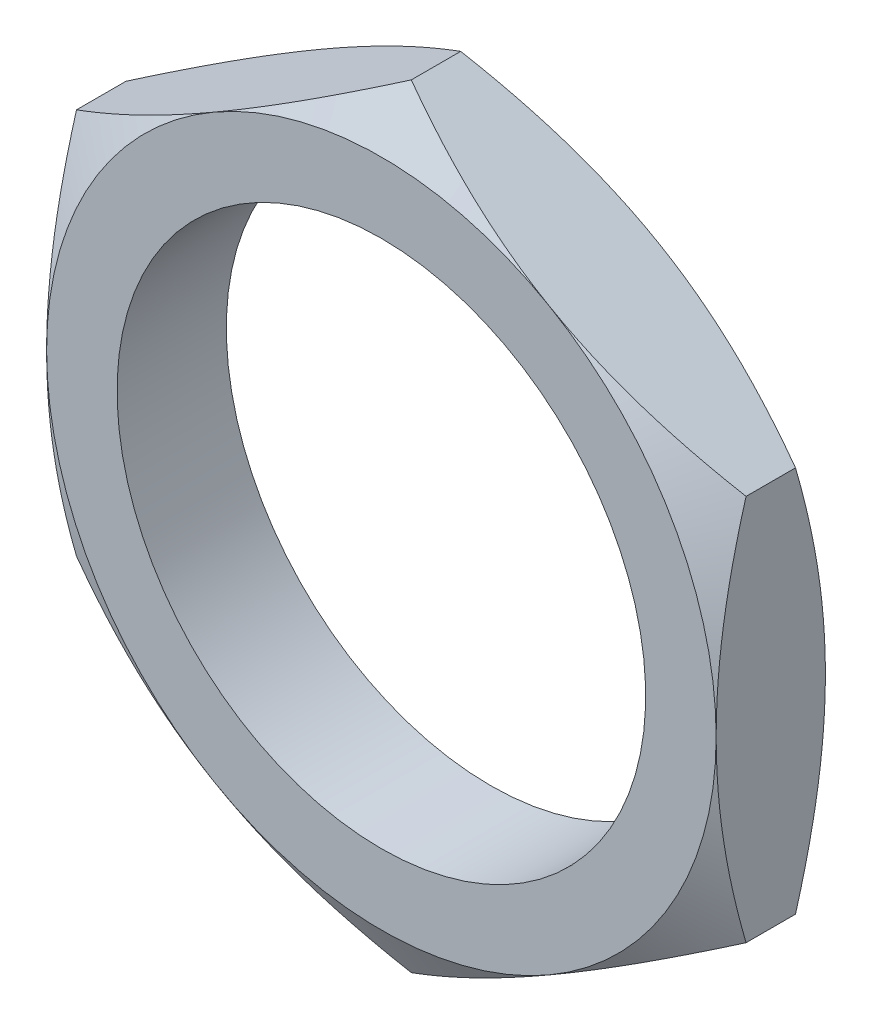
ISO-10303-21;
HEADER;
FILE_DESCRIPTION(('STEP AP214'),'2;1');
FILE_NAME('part.step','',(''),(''),'','','');
FILE_SCHEMA(('AUTOMOTIVE_DESIGN { 1 0 10303 214 1 1 1 1 }'));
ENDSEC;
DATA;
#1=APPLICATION_CONTEXT('core data for automotive mechanical design processes');
#2=APPLICATION_PROTOCOL_DEFINITION('international standard','automotive_design',2000,#1);
#3=PRODUCT_CONTEXT('',#1,'mechanical');
#4=PRODUCT('Part','Part','',(#3));
#5=PRODUCT_RELATED_PRODUCT_CATEGORY('part','',(#4));
#6=PRODUCT_DEFINITION_FORMATION('','',#4);
#7=PRODUCT_DEFINITION_CONTEXT('part definition',#1,'design');
#8=PRODUCT_DEFINITION('design','',#6,#7);
#9=PRODUCT_DEFINITION_SHAPE('','',#8);
#10=(LENGTH_UNIT() NAMED_UNIT(*) SI_UNIT(.MILLI.,.METRE.));
#11=(NAMED_UNIT(*) PLANE_ANGLE_UNIT() SI_UNIT($,.RADIAN.));
#12=(NAMED_UNIT(*) SI_UNIT($,.STERADIAN.) SOLID_ANGLE_UNIT());
#13=UNCERTAINTY_MEASURE_WITH_UNIT(LENGTH_MEASURE(1.E-05),#10,'distance_accuracy_value','');
#14=(GEOMETRIC_REPRESENTATION_CONTEXT(3) GLOBAL_UNCERTAINTY_ASSIGNED_CONTEXT((#13)) GLOBAL_UNIT_ASSIGNED_CONTEXT((#10,
#11,#12)) REPRESENTATION_CONTEXT('',''));
#15=CARTESIAN_POINT('',(0.,0.,0.));
#16=DIRECTION('',(0.,0.,1.));
#17=DIRECTION('',(1.,0.,0.));
#18=AXIS2_PLACEMENT_3D('',#15,#16,#17);
#19=CARTESIAN_POINT('',(0.,0.,-2.25149422396811));
#20=DIRECTION('',(0.,0.,1.));
#21=DIRECTION('',(0.,-1.,0.));
#22=AXIS2_PLACEMENT_3D('',#19,#20,#21);
#23=CONICAL_SURFACE('',#22,10.9696551146029,1.0471975511966);
#24=CARTESIAN_POINT('',(4.75,8.22724133595216,-3.10000000000001));
#25=CARTESIAN_POINT('',(3.573596919709,8.90643797103368,-3.10000000000001));
#26=CARTESIAN_POINT('',(2.34761870195911,9.61425682507219,-2.87094831845867));
#27=CARTESIAN_POINT('',(1.2344191554717,10.2569628828985,-2.6629672757922));
#28=CARTESIAN_POINT('',(0.,10.9696551146029,-2.2514942239683));
#29=B_SPLINE_CURVE_WITH_KNOTS('',2,(#24,#25,#26,#27,#28),.UNSPECIFIED.,.F.,.F.,(3,2,3),(0.,0.5,
1.),.UNSPECIFIED.);
#30=CARTESIAN_POINT('',(4.75,8.22724133595217,-3.1));
#31=VERTEX_POINT('',#30);
#32=CARTESIAN_POINT('',(0.,10.9696551146029,-2.25149422396811));
#33=VERTEX_POINT('',#32);
#34=EDGE_CURVE('E11',#31,#33,#29,.T.);
#35=ORIENTED_EDGE('',*,*,#34,.F.);
#36=CARTESIAN_POINT('',(0.,0.,-3.1));
#37=DIRECTION('',(0.,0.,1.));
#38=DIRECTION('',(0.,-1.,0.));
#39=AXIS2_PLACEMENT_3D('',#36,#37,#38);
#40=CIRCLE('',#39,9.5);
#41=CARTESIAN_POINT('',(-4.75,8.22724133595217,-3.1));
#42=VERTEX_POINT('',#41);
#43=EDGE_CURVE('E386',#31,#42,#40,.T.);
#44=ORIENTED_EDGE('',*,*,#43,.T.);
#45=CARTESIAN_POINT('',(0.,10.9696551146029,-2.25149422396848));
#46=CARTESIAN_POINT('',(-1.23556096289598,10.2563036600747,-2.66334787826714));
#47=CARTESIAN_POINT('',(-2.35064596605713,9.61250903333031,-2.87151368023624));
#48=CARTESIAN_POINT('',(-3.57458220431533,8.905869116701,-3.10000000000001));
#49=CARTESIAN_POINT('',(-4.75000000000001,8.22724133595218,-3.10000000000001));
#50=B_SPLINE_CURVE_WITH_KNOTS('',2,(#45,#46,#47,#48,#49),.UNSPECIFIED.,.F.,.F.,(3,2,3),(0.,0.5,
1.),.UNSPECIFIED.);
#51=EDGE_CURVE('E547',#33,#42,#50,.T.);
#52=ORIENTED_EDGE('',*,*,#51,.F.);
#53=EDGE_LOOP('',(#35,#44,#52));
#54=FACE_BOUND('',#53,.T.);
#55=ADVANCED_FACE('F16',(#54),#23,.T.);
#56=CARTESIAN_POINT('',(0.,0.,-29.2706994757567));
#57=DIRECTION('',(0.,0.,-1.));
#58=DIRECTION('',(0.,-1.,0.));
#59=AXIS2_PLACEMENT_3D('',#56,#57,#58);
#60=CYLINDRICAL_SURFACE('',#59,7.5);
#61=CARTESIAN_POINT('',(0.,0.,0.));
#62=DIRECTION('',(0.,0.,-1.));
#63=DIRECTION('',(0.,1.,0.));
#64=AXIS2_PLACEMENT_3D('',#61,#62,#63);
#65=CIRCLE('',#64,7.5);
#66=CARTESIAN_POINT('',(0.,7.5,0.));
#67=VERTEX_POINT('',#66);
#68=EDGE_CURVE('E514',#67,#67,#65,.T.);
#69=ORIENTED_EDGE('',*,*,#68,.F.);
#70=EDGE_LOOP('',(#69));
#71=FACE_BOUND('',#70,.T.);
#72=CARTESIAN_POINT('',(0.,0.,-3.1));
#73=DIRECTION('',(0.,0.,-1.));
#74=DIRECTION('',(0.,1.,0.));
#75=AXIS2_PLACEMENT_3D('',#72,#73,#74);
#76=CIRCLE('',#75,7.5);
#77=CARTESIAN_POINT('',(0.,7.5,-3.1));
#78=VERTEX_POINT('',#77);
#79=EDGE_CURVE('E41',#78,#78,#76,.T.);
#80=ORIENTED_EDGE('',*,*,#79,.T.);
#81=EDGE_LOOP('',(#80));
#82=FACE_BOUND('',#81,.T.);
#83=ADVANCED_FACE('F368',(#71,#82),#60,.F.);
#84=CARTESIAN_POINT('',(0.,0.,-2.25149422396811));
#85=DIRECTION('',(0.,0.,1.));
#86=DIRECTION('',(0.,-1.,0.));
#87=AXIS2_PLACEMENT_3D('',#84,#85,#86);
#88=CONICAL_SURFACE('',#87,10.9696551146029,1.0471975511966);
#89=CARTESIAN_POINT('',(0.,0.,-3.1));
#90=DIRECTION('',(0.,0.,1.));
#91=DIRECTION('',(0.,-1.,0.));
#92=AXIS2_PLACEMENT_3D('',#89,#90,#91);
#93=CIRCLE('',#92,9.5);
#94=CARTESIAN_POINT('',(-9.5,0.,-3.1));
#95=VERTEX_POINT('',#94);
#96=CARTESIAN_POINT('',(-4.75,-8.22724133595217,-3.1));
#97=VERTEX_POINT('',#96);
#98=EDGE_CURVE('E387',#95,#97,#93,.T.);
#99=ORIENTED_EDGE('',*,*,#98,.T.);
#100=CARTESIAN_POINT('',(-9.50000000000003,-5.48482755730142,-2.25149422396848));
#101=CARTESIAN_POINT('',(-8.26443903709639,-6.19817901183403,-2.6633478782697));
#102=CARTESIAN_POINT('',(-7.14935403394288,-6.84197363857403,-2.87151368023625));
#103=CARTESIAN_POINT('',(-5.9254177956781,-7.54861355520713,-3.10000000000001));
#104=CARTESIAN_POINT('',(-4.75,-8.22724133595216,-3.10000000000001));
#105=B_SPLINE_CURVE_WITH_KNOTS('',2,(#100,#101,#102,#103,#104),.UNSPECIFIED.,.F.,.F.,(3,2,3),
(0.,0.5,1.),.UNSPECIFIED.);
#106=CARTESIAN_POINT('',(-9.5,-5.48482755730145,-2.25149422396811));
#107=VERTEX_POINT('',#106);
#108=EDGE_CURVE('E355',#107,#97,#105,.T.);
#109=ORIENTED_EDGE('',*,*,#108,.F.);
#110=CARTESIAN_POINT('',(-9.5,0.,-3.1));
#111=CARTESIAN_POINT('',(-9.5,-1.35339138546584,-3.1));
#112=CARTESIAN_POINT('',(-9.5,-2.763401999936,-2.87266536850783));
#113=CARTESIAN_POINT('',(-9.5,-4.05364726800735,-2.66464038660958));
#114=CARTESIAN_POINT('',(-9.5,-5.48482755730145,-2.25149422396814));
#115=B_SPLINE_CURVE_WITH_KNOTS('',2,(#110,#111,#112,#113,#114),.UNSPECIFIED.,.F.,.F.,(3,2,3),
(0.,0.5,1.),.UNSPECIFIED.);
#116=EDGE_CURVE('E435',#95,#107,#115,.T.);
#117=ORIENTED_EDGE('',*,*,#116,.F.);
#118=EDGE_LOOP('',(#99,#109,#117));
#119=FACE_BOUND('',#118,.T.);
#120=ADVANCED_FACE('F359',(#119),#88,.T.);
#121=CARTESIAN_POINT('',(0.,0.,-0.848505776031886));
#122=DIRECTION('',(0.,0.,-1.));
#123=DIRECTION('',(0.,-1.,0.));
#124=AXIS2_PLACEMENT_3D('',#121,#122,#123);
#125=CONICAL_SURFACE('',#124,10.9696551146029,1.0471975511966);
#126=CARTESIAN_POINT('',(0.,0.,0.));
#127=DIRECTION('',(0.,0.,-1.));
#128=DIRECTION('',(0.,-1.,0.));
#129=AXIS2_PLACEMENT_3D('',#126,#127,#128);
#130=CIRCLE('',#129,9.5);
#131=CARTESIAN_POINT('',(-9.5,0.,0.));
#132=VERTEX_POINT('',#131);
#133=CARTESIAN_POINT('',(-4.75,8.22724133595217,0.));
#134=VERTEX_POINT('',#133);
#135=EDGE_CURVE('E475',#132,#134,#130,.T.);
#136=ORIENTED_EDGE('',*,*,#135,.T.);
#137=CARTESIAN_POINT('',(-9.50000000000007,5.48482755730142,-0.848505776031525));
#138=CARTESIAN_POINT('',(-8.26443903710588,6.19817901182857,-0.43665212173346));
#139=CARTESIAN_POINT('',(-7.14935403394289,6.84197363857403,-0.228486319763755));
#140=CARTESIAN_POINT('',(-5.92541779568629,7.54861355520242,0.));
#141=CARTESIAN_POINT('',(-4.75000000000001,8.22724133595218,0.));
#142=B_SPLINE_CURVE_WITH_KNOTS('',2,(#137,#138,#139,#140,#141),.UNSPECIFIED.,.F.,.F.,(3,2,3),
(0.,0.5,1.),.UNSPECIFIED.);
#143=CARTESIAN_POINT('',(-9.5,5.48482755730143,-0.848505776031886));
#144=VERTEX_POINT('',#143);
#145=EDGE_CURVE('E490',#144,#134,#142,.T.);
#146=ORIENTED_EDGE('',*,*,#145,.F.);
#147=CARTESIAN_POINT('',(-9.5,0.,0.));
#148=CARTESIAN_POINT('',(-9.5,1.36281115795138,0.));
#149=CARTESIAN_POINT('',(-9.5,2.78343248020029,-0.23057550144644));
#150=CARTESIAN_POINT('',(-9.5,4.06456364457513,-0.43851089986546));
#151=CARTESIAN_POINT('',(-9.5,5.48482755730143,-0.848505776031885));
#152=B_SPLINE_CURVE_WITH_KNOTS('',2,(#147,#148,#149,#150,#151),.UNSPECIFIED.,.F.,.F.,(3,2,3),
(0.,0.5,1.),.UNSPECIFIED.);
#153=EDGE_CURVE('E30',#132,#144,#152,.T.);
#154=ORIENTED_EDGE('',*,*,#153,.F.);
#155=EDGE_LOOP('',(#136,#146,#154));
#156=FACE_BOUND('',#155,.T.);
#157=ADVANCED_FACE('F283',(#156),#125,.T.);
#158=CARTESIAN_POINT('',(0.,0.,-2.25149422396811));
#159=DIRECTION('',(0.,0.,1.));
#160=DIRECTION('',(0.,-1.,0.));
#161=AXIS2_PLACEMENT_3D('',#158,#159,#160);
#162=CONICAL_SURFACE('',#161,10.9696551146029,1.0471975511966);
#163=CARTESIAN_POINT('',(0.,0.,-3.1));
#164=DIRECTION('',(0.,0.,1.));
#165=DIRECTION('',(0.,-1.,0.));
#166=AXIS2_PLACEMENT_3D('',#163,#164,#165);
#167=CIRCLE('',#166,9.5);
#168=CARTESIAN_POINT('',(4.75,-8.22724133595217,-3.1));
#169=VERTEX_POINT('',#168);
#170=CARTESIAN_POINT('',(9.5,0.,-3.1));
#171=VERTEX_POINT('',#170);
#172=EDGE_CURVE('E98',#169,#171,#167,.T.);
#173=ORIENTED_EDGE('',*,*,#172,.T.);
#174=CARTESIAN_POINT('',(9.5,-5.48482755730145,-2.25149422396815));
#175=CARTESIAN_POINT('',(9.5,-4.05424115571348,-2.66446894599606));
#176=CARTESIAN_POINT('',(9.5,-2.76340199993599,-2.87266536850784));
#177=CARTESIAN_POINT('',(9.5,-1.35390398717479,-3.1));
#178=CARTESIAN_POINT('',(9.5,0.,-3.1));
#179=B_SPLINE_CURVE_WITH_KNOTS('',2,(#174,#175,#176,#177,#178),.UNSPECIFIED.,.F.,.F.,(3,2,3),
(0.,0.5,1.),.UNSPECIFIED.);
#180=CARTESIAN_POINT('',(9.5,-5.48482755730143,-2.25149422396811));
#181=VERTEX_POINT('',#180);
#182=EDGE_CURVE('E191',#181,#171,#179,.T.);
#183=ORIENTED_EDGE('',*,*,#182,.F.);
#184=CARTESIAN_POINT('',(4.75000000000001,-8.22724133595218,-3.10000000000001));
#185=CARTESIAN_POINT('',(5.92640308028883,-7.54804470087192,-3.10000000000001));
#186=CARTESIAN_POINT('',(7.15238129804089,-6.84022584683215,-2.87094831845867));
#187=CARTESIAN_POINT('',(8.26558084452585,-6.19751978900729,-2.66296727579302));
#188=CARTESIAN_POINT('',(9.50000000000005,-5.48482755730143,-2.2514942239683));
#189=B_SPLINE_CURVE_WITH_KNOTS('',2,(#184,#185,#186,#187,#188),.UNSPECIFIED.,.F.,.F.,(3,2,3),
(0.,0.5,1.),.UNSPECIFIED.);
#190=EDGE_CURVE('E224',#169,#181,#189,.T.);
#191=ORIENTED_EDGE('',*,*,#190,.F.);
#192=EDGE_LOOP('',(#173,#183,#191));
#193=FACE_BOUND('',#192,.T.);
#194=ADVANCED_FACE('F272',(#193),#162,.T.);
#195=CARTESIAN_POINT('',(0.,0.,-0.848505776031886));
#196=DIRECTION('',(0.,0.,-1.));
#197=DIRECTION('',(0.,-1.,0.));
#198=AXIS2_PLACEMENT_3D('',#195,#196,#197);
#199=CONICAL_SURFACE('',#198,10.9696551146029,1.0471975511966);
#200=CARTESIAN_POINT('',(0.,0.,0.));
#201=DIRECTION('',(0.,0.,-1.));
#202=DIRECTION('',(0.,-1.,0.));
#203=AXIS2_PLACEMENT_3D('',#200,#201,#202);
#204=CIRCLE('',#203,9.5);
#205=CARTESIAN_POINT('',(-4.75,-8.22724133595217,0.));
#206=VERTEX_POINT('',#205);
#207=EDGE_CURVE('E214',#206,#132,#204,.T.);
#208=ORIENTED_EDGE('',*,*,#207,.T.);
#209=CARTESIAN_POINT('',(-9.5,-5.48482755730145,-0.848505776031855));
#210=CARTESIAN_POINT('',(-9.5,-4.05424115570597,-0.43553105400177));
#211=CARTESIAN_POINT('',(-9.5,-2.763401999936,-0.227334631492165));
#212=CARTESIAN_POINT('',(-9.5,-1.3539039871683,0.));
#213=CARTESIAN_POINT('',(-9.5,0.,0.));
#214=B_SPLINE_CURVE_WITH_KNOTS('',2,(#209,#210,#211,#212,#213),.UNSPECIFIED.,.F.,.F.,(3,2,3),
(0.,0.5,1.),.UNSPECIFIED.);
#215=CARTESIAN_POINT('',(-9.5,-5.48482755730145,-0.848505776031886));
#216=VERTEX_POINT('',#215);
#217=EDGE_CURVE('E494',#216,#132,#214,.T.);
#218=ORIENTED_EDGE('',*,*,#217,.F.);
#219=CARTESIAN_POINT('',(-4.75,-8.22724133595216,0.));
#220=CARTESIAN_POINT('',(-5.92640308028637,-7.54804470087332,0.));
#221=CARTESIAN_POINT('',(-7.15238129804087,-6.84022584683214,-0.229051681541323));
#222=CARTESIAN_POINT('',(-8.26558084452298,-6.19751978900893,-0.437032724206014));
#223=CARTESIAN_POINT('',(-9.50000000000001,-5.48482755730143,-0.848505776031699));
#224=B_SPLINE_CURVE_WITH_KNOTS('',2,(#219,#220,#221,#222,#223),.UNSPECIFIED.,.F.,.F.,(3,2,3),
(0.,0.5,1.),.UNSPECIFIED.);
#225=EDGE_CURVE('E313',#206,#216,#224,.T.);
#226=ORIENTED_EDGE('',*,*,#225,.F.);
#227=EDGE_LOOP('',(#208,#218,#226));
#228=FACE_BOUND('',#227,.T.);
#229=ADVANCED_FACE('F282',(#228),#199,.T.);
#230=CARTESIAN_POINT('',(9.5,5.48482755730144,-3.1));
#231=DIRECTION('',(0.5,0.866025403784439,0.));
#232=DIRECTION('',(0.,0.,-1.));
#233=AXIS2_PLACEMENT_3D('',#230,#231,#232);
#234=PLANE('',#233);
#235=DIRECTION('',(0.,0.,1.));
#236=VECTOR('',#235,1.);
#237=CARTESIAN_POINT('',(9.5,5.48482755730144,-3.1));
#238=LINE('',#237,#236);
#239=CARTESIAN_POINT('',(9.5,5.48482755730144,-2.25149422396811));
#240=VERTEX_POINT('',#239);
#241=CARTESIAN_POINT('',(9.5,5.48482755730144,-0.848505776031886));
#242=VERTEX_POINT('',#241);
#243=EDGE_CURVE('E175',#240,#242,#238,.T.);
#244=ORIENTED_EDGE('',*,*,#243,.F.);
#245=CARTESIAN_POINT('',(9.50000000000004,5.48482755730142,-2.25149422396848));
#246=CARTESIAN_POINT('',(8.26443903710279,6.19817901183033,-2.66334787826756));
#247=CARTESIAN_POINT('',(7.14935403394288,6.84197363857403,-2.87151368023625));
#248=CARTESIAN_POINT('',(5.92541779568363,7.54861355520394,-3.10000000000001));
#249=CARTESIAN_POINT('',(4.75,8.22724133595216,-3.10000000000001));
#250=B_SPLINE_CURVE_WITH_KNOTS('',2,(#245,#246,#247,#248,#249),.UNSPECIFIED.,.F.,.F.,(3,2,3),
(0.,0.5,1.),.UNSPECIFIED.);
#251=EDGE_CURVE('E541',#240,#31,#250,.T.);
#252=ORIENTED_EDGE('',*,*,#251,.T.);
#253=ORIENTED_EDGE('',*,*,#34,.T.);
#254=DIRECTION('',(0.,0.,1.));
#255=VECTOR('',#254,1.);
#256=CARTESIAN_POINT('',(0.,10.9696551146029,-3.1));
#257=LINE('',#256,#255);
#258=CARTESIAN_POINT('',(0.,10.9696551146029,-0.848505776031886));
#259=VERTEX_POINT('',#258);
#260=EDGE_CURVE('E544',#33,#259,#257,.T.);
#261=ORIENTED_EDGE('',*,*,#260,.T.);
#262=CARTESIAN_POINT('',(0.,10.9696551146029,-0.84850577603152));
#263=CARTESIAN_POINT('',(1.23556096289188,10.2563036600771,-0.436652121734215));
#264=CARTESIAN_POINT('',(2.35064596605712,9.6125090333303,-0.22848631976375));
#265=CARTESIAN_POINT('',(3.57458220431173,8.90586911670306,0.));
#266=CARTESIAN_POINT('',(4.75,8.22724133595216,0.));
#267=B_SPLINE_CURVE_WITH_KNOTS('',2,(#262,#263,#264,#265,#266),.UNSPECIFIED.,.F.,.F.,(3,2,3),
(0.,0.5,1.),.UNSPECIFIED.);
#268=CARTESIAN_POINT('',(4.75,8.22724133595217,0.));
#269=VERTEX_POINT('',#268);
#270=EDGE_CURVE('E136',#259,#269,#267,.T.);
#271=ORIENTED_EDGE('',*,*,#270,.T.);
#272=CARTESIAN_POINT('',(4.75,8.22724133595216,0.));
#273=CARTESIAN_POINT('',(5.92640308028638,7.54804470087331,0.));
#274=CARTESIAN_POINT('',(7.15238129804087,6.84022584683214,-0.229051681541325));
#275=CARTESIAN_POINT('',(8.26558084452297,6.19751978900894,-0.43703272420601));
#276=CARTESIAN_POINT('',(9.50000000000002,5.48482755730143,-0.8485057760317));
#277=B_SPLINE_CURVE_WITH_KNOTS('',2,(#272,#273,#274,#275,#276),.UNSPECIFIED.,.F.,.F.,(3,2,3),
(0.,0.5,1.),.UNSPECIFIED.);
#278=EDGE_CURVE('E192',#269,#242,#277,.T.);
#279=ORIENTED_EDGE('',*,*,#278,.T.);
#280=EDGE_LOOP('',(#244,#252,#253,#261,#271,#279));
#281=FACE_BOUND('',#280,.T.);
#282=ADVANCED_FACE('F328',(#281),#234,.T.);
#283=CARTESIAN_POINT('',(0.,0.,-2.25149422396811));
#284=DIRECTION('',(0.,0.,1.));
#285=DIRECTION('',(0.,-1.,0.));
#286=AXIS2_PLACEMENT_3D('',#283,#284,#285);
#287=CONICAL_SURFACE('',#286,10.9696551146029,1.0471975511966);
#288=CARTESIAN_POINT('',(0.,0.,-3.1));
#289=DIRECTION('',(0.,0.,1.));
#290=DIRECTION('',(0.,-1.,0.));
#291=AXIS2_PLACEMENT_3D('',#288,#289,#290);
#292=CIRCLE('',#291,9.5);
#293=EDGE_CURVE('E377',#42,#95,#292,.T.);
#294=ORIENTED_EDGE('',*,*,#293,.T.);
#295=CARTESIAN_POINT('',(-9.5,5.48482755730143,-2.25149422396812));
#296=CARTESIAN_POINT('',(-9.5,4.06515029664638,-2.6613197482689));
#297=CARTESIAN_POINT('',(-9.5,2.78343248020029,-2.86942449855357));
#298=CARTESIAN_POINT('',(-9.5,1.36331723614347,-3.1));
#299=CARTESIAN_POINT('',(-9.5,0.,-3.1));
#300=B_SPLINE_CURVE_WITH_KNOTS('',2,(#295,#296,#297,#298,#299),.UNSPECIFIED.,.F.,.F.,(3,2,3),
(0.,0.5,1.),.UNSPECIFIED.);
#301=CARTESIAN_POINT('',(-9.5,5.48482755730143,-2.25149422396811));
#302=VERTEX_POINT('',#301);
#303=EDGE_CURVE('E398',#302,#95,#300,.T.);
#304=ORIENTED_EDGE('',*,*,#303,.F.);
#305=CARTESIAN_POINT('',(-4.75000000000001,8.22724133595218,-3.10000000000001));
#306=CARTESIAN_POINT('',(-5.92640308028487,7.5480447008742,-3.10000000000001));
#307=CARTESIAN_POINT('',(-7.15238129804089,6.84022584683215,-2.87094831845867));
#308=CARTESIAN_POINT('',(-8.2655808445213,6.19751978900991,-2.66296727579455));
#309=CARTESIAN_POINT('',(-9.50000000000005,5.48482755730143,-2.25149422396829));
#310=B_SPLINE_CURVE_WITH_KNOTS('',2,(#305,#306,#307,#308,#309),.UNSPECIFIED.,.F.,.F.,(3,2,3),
(0.,0.5,1.),.UNSPECIFIED.);
#311=EDGE_CURVE('E491',#42,#302,#310,.T.);
#312=ORIENTED_EDGE('',*,*,#311,.F.);
#313=EDGE_LOOP('',(#294,#304,#312));
#314=FACE_BOUND('',#313,.T.);
#315=ADVANCED_FACE('F285',(#314),#287,.T.);
#316=CARTESIAN_POINT('',(-9.5,5.48482755730145,-3.1));
#317=DIRECTION('',(-1.,0.,0.));
#318=DIRECTION('',(0.,0.,1.));
#319=AXIS2_PLACEMENT_3D('',#316,#317,#318);
#320=PLANE('',#319);
#321=DIRECTION('',(0.,0.,1.));
#322=VECTOR('',#321,1.);
#323=CARTESIAN_POINT('',(-9.5,5.48482755730145,-3.1));
#324=LINE('',#323,#322);
#325=EDGE_CURVE('E486',#302,#144,#324,.T.);
#326=ORIENTED_EDGE('',*,*,#325,.F.);
#327=ORIENTED_EDGE('',*,*,#303,.T.);
#328=ORIENTED_EDGE('',*,*,#116,.T.);
#329=DIRECTION('',(0.,0.,1.));
#330=VECTOR('',#329,1.);
#331=CARTESIAN_POINT('',(-9.5,-5.48482755730144,-3.1));
#332=LINE('',#331,#330);
#333=EDGE_CURVE('E438',#107,#216,#332,.T.);
#334=ORIENTED_EDGE('',*,*,#333,.T.);
#335=ORIENTED_EDGE('',*,*,#217,.T.);
#336=ORIENTED_EDGE('',*,*,#153,.T.);
#337=EDGE_LOOP('',(#326,#327,#328,#334,#335,#336));
#338=FACE_BOUND('',#337,.T.);
#339=ADVANCED_FACE('F403',(#338),#320,.T.);
#340=CARTESIAN_POINT('',(-9.5,5.48482755730144,-3.1));
#341=DIRECTION('',(0.,0.,1.));
#342=DIRECTION('',(1.,0.,0.));
#343=AXIS2_PLACEMENT_3D('',#340,#341,#342);
#344=PLANE('',#343);
#345=ORIENTED_EDGE('',*,*,#79,.F.);
#346=EDGE_LOOP('',(#345));
#347=FACE_BOUND('',#346,.T.);
#348=ORIENTED_EDGE('',*,*,#172,.F.);
#349=CARTESIAN_POINT('',(0.,0.,-3.1));
#350=DIRECTION('',(0.,0.,1.));
#351=DIRECTION('',(0.,-1.,0.));
#352=AXIS2_PLACEMENT_3D('',#349,#350,#351);
#353=CIRCLE('',#352,9.5);
#354=EDGE_CURVE('E295',#97,#169,#353,.T.);
#355=ORIENTED_EDGE('',*,*,#354,.F.);
#356=ORIENTED_EDGE('',*,*,#98,.F.);
#357=ORIENTED_EDGE('',*,*,#293,.F.);
#358=ORIENTED_EDGE('',*,*,#43,.F.);
#359=CARTESIAN_POINT('',(0.,0.,-3.1));
#360=DIRECTION('',(0.,0.,1.));
#361=DIRECTION('',(0.,-1.,0.));
#362=AXIS2_PLACEMENT_3D('',#359,#360,#361);
#363=CIRCLE('',#362,9.5);
#364=EDGE_CURVE('E537',#171,#31,#363,.T.);
#365=ORIENTED_EDGE('',*,*,#364,.F.);
#366=EDGE_LOOP('',(#348,#355,#356,#357,#358,#365));
#367=FACE_BOUND('',#366,.T.);
#368=ADVANCED_FACE('F249',(#347,#367),#344,.F.);
#369=CARTESIAN_POINT('',(0.,0.,-2.25149422396811));
#370=DIRECTION('',(0.,0.,1.));
#371=DIRECTION('',(0.,-1.,0.));
#372=AXIS2_PLACEMENT_3D('',#369,#370,#371);
#373=CONICAL_SURFACE('',#372,10.9696551146029,1.0471975511966);
#374=ORIENTED_EDGE('',*,*,#364,.T.);
#375=ORIENTED_EDGE('',*,*,#251,.F.);
#376=CARTESIAN_POINT('',(9.5,0.,-3.1));
#377=CARTESIAN_POINT('',(9.5,1.36281115794959,-3.1));
#378=CARTESIAN_POINT('',(9.5,2.7834324802003,-2.86942449855356));
#379=CARTESIAN_POINT('',(9.5,4.06456364457302,-2.66148910013515));
#380=CARTESIAN_POINT('',(9.5,5.48482755730144,-2.25149422396811));
#381=B_SPLINE_CURVE_WITH_KNOTS('',2,(#376,#377,#378,#379,#380),.UNSPECIFIED.,.F.,.F.,(3,2,3),
(0.,0.5,1.),.UNSPECIFIED.);
#382=EDGE_CURVE('E230',#171,#240,#381,.T.);
#383=ORIENTED_EDGE('',*,*,#382,.F.);
#384=EDGE_LOOP('',(#374,#375,#383));
#385=FACE_BOUND('',#384,.T.);
#386=ADVANCED_FACE('F666',(#385),#373,.T.);
#387=CARTESIAN_POINT('',(0.,0.,-0.848505776031886));
#388=DIRECTION('',(0.,0.,-1.));
#389=DIRECTION('',(0.,-1.,0.));
#390=AXIS2_PLACEMENT_3D('',#387,#388,#389);
#391=CONICAL_SURFACE('',#390,10.9696551146029,1.0471975511966);
#392=CARTESIAN_POINT('',(4.75000000000001,-8.22724133595218,0.));
#393=CARTESIAN_POINT('',(3.57359691971264,-8.90643797103159,0.));
#394=CARTESIAN_POINT('',(2.34761870195913,-9.61425682507219,-0.229051681541325));
#395=CARTESIAN_POINT('',(1.23441915547591,-10.2569628828961,-0.43703272420639));
#396=CARTESIAN_POINT('',(0.,-10.9696551146029,-0.8485057760317));
#397=B_SPLINE_CURVE_WITH_KNOTS('',2,(#392,#393,#394,#395,#396),.UNSPECIFIED.,.F.,.F.,(3,2,3),
(0.,0.5,1.),.UNSPECIFIED.);
#398=CARTESIAN_POINT('',(4.75,-8.22724133595217,0.));
#399=VERTEX_POINT('',#398);
#400=CARTESIAN_POINT('',(0.,-10.9696551146029,-0.848505776031886));
#401=VERTEX_POINT('',#400);
#402=EDGE_CURVE('E470',#399,#401,#397,.T.);
#403=ORIENTED_EDGE('',*,*,#402,.F.);
#404=CARTESIAN_POINT('',(0.,0.,0.));
#405=DIRECTION('',(0.,0.,-1.));
#406=DIRECTION('',(0.,-1.,0.));
#407=AXIS2_PLACEMENT_3D('',#404,#405,#406);
#408=CIRCLE('',#407,9.5);
#409=EDGE_CURVE('E207',#399,#206,#408,.T.);
#410=ORIENTED_EDGE('',*,*,#409,.T.);
#411=CARTESIAN_POINT('',(0.,-10.9696551146029,-0.848505776031519));
#412=CARTESIAN_POINT('',(-1.23556096289189,-10.2563036600771,-0.436652121734213));
#413=CARTESIAN_POINT('',(-2.35064596605712,-9.6125090333303,-0.228486319763749));
#414=CARTESIAN_POINT('',(-3.57458220431173,-8.90586911670306,0.));
#415=CARTESIAN_POINT('',(-4.75,-8.22724133595216,0.));
#416=B_SPLINE_CURVE_WITH_KNOTS('',2,(#411,#412,#413,#414,#415),.UNSPECIFIED.,.F.,.F.,(3,2,3),
(0.,0.5,1.),.UNSPECIFIED.);
#417=EDGE_CURVE('E466',#401,#206,#416,.T.);
#418=ORIENTED_EDGE('',*,*,#417,.F.);
#419=EDGE_LOOP('',(#403,#410,#418));
#420=FACE_BOUND('',#419,.T.);
#421=ADVANCED_FACE('F469',(#420),#391,.T.);
#422=CARTESIAN_POINT('',(0.,0.,-0.848505776031886));
#423=DIRECTION('',(0.,0.,-1.));
#424=DIRECTION('',(0.,-1.,0.));
#425=AXIS2_PLACEMENT_3D('',#422,#423,#424);
#426=CONICAL_SURFACE('',#425,10.9696551146029,1.0471975511966);
#427=CARTESIAN_POINT('',(9.5,0.,0.));
#428=CARTESIAN_POINT('',(9.5,-1.35339138547119,0.));
#429=CARTESIAN_POINT('',(9.5,-2.76340199993598,-0.227334631492165));
#430=CARTESIAN_POINT('',(9.5,-4.05364726801351,-0.435359613392215));
#431=CARTESIAN_POINT('',(9.5,-5.48482755730145,-0.84850577603185));
#432=B_SPLINE_CURVE_WITH_KNOTS('',2,(#427,#428,#429,#430,#431),.UNSPECIFIED.,.F.,.F.,(3,2,3),
(0.,0.5,1.),.UNSPECIFIED.);
#433=CARTESIAN_POINT('',(9.5,0.,0.));
#434=VERTEX_POINT('',#433);
#435=CARTESIAN_POINT('',(9.5,-5.48482755730143,-0.848505776031886));
#436=VERTEX_POINT('',#435);
#437=EDGE_CURVE('E160',#434,#436,#432,.T.);
#438=ORIENTED_EDGE('',*,*,#437,.F.);
#439=CARTESIAN_POINT('',(0.,0.,0.));
#440=DIRECTION('',(0.,0.,-1.));
#441=DIRECTION('',(0.,-1.,0.));
#442=AXIS2_PLACEMENT_3D('',#439,#440,#441);
#443=CIRCLE('',#442,9.5);
#444=EDGE_CURVE('E165',#434,#399,#443,.T.);
#445=ORIENTED_EDGE('',*,*,#444,.T.);
#446=CARTESIAN_POINT('',(9.50000000000007,-5.48482755730142,-0.848505776031525));
#447=CARTESIAN_POINT('',(8.26443903710588,-6.19817901182857,-0.43665212173346));
#448=CARTESIAN_POINT('',(7.14935403394289,-6.84197363857403,-0.228486319763755));
#449=CARTESIAN_POINT('',(5.92541779568629,-7.54861355520242,0.));
#450=CARTESIAN_POINT('',(4.75000000000001,-8.22724133595218,0.));
#451=B_SPLINE_CURVE_WITH_KNOTS('',2,(#446,#447,#448,#449,#450),.UNSPECIFIED.,.F.,.F.,(3,2,3),
(0.,0.5,1.),.UNSPECIFIED.);
#452=EDGE_CURVE('E168',#436,#399,#451,.T.);
#453=ORIENTED_EDGE('',*,*,#452,.F.);
#454=EDGE_LOOP('',(#438,#445,#453));
#455=FACE_BOUND('',#454,.T.);
#456=ADVANCED_FACE('F163',(#455),#426,.T.);
#457=CARTESIAN_POINT('',(0.,0.,-0.848505776031886));
#458=DIRECTION('',(0.,0.,-1.));
#459=DIRECTION('',(0.,-1.,0.));
#460=AXIS2_PLACEMENT_3D('',#457,#458,#459);
#461=CONICAL_SURFACE('',#460,10.9696551146029,1.0471975511966);
#462=CARTESIAN_POINT('',(0.,0.,0.));
#463=DIRECTION('',(0.,0.,-1.));
#464=DIRECTION('',(0.,-1.,0.));
#465=AXIS2_PLACEMENT_3D('',#462,#463,#464);
#466=CIRCLE('',#465,9.5);
#467=EDGE_CURVE('E202',#134,#269,#466,.T.);
#468=ORIENTED_EDGE('',*,*,#467,.T.);
#469=ORIENTED_EDGE('',*,*,#270,.F.);
#470=CARTESIAN_POINT('',(-4.75000000000001,8.22724133595218,0.));
#471=CARTESIAN_POINT('',(-3.57359691971512,8.90643797103016,0.));
#472=CARTESIAN_POINT('',(-2.34761870195913,9.6142568250722,-0.22905168154133));
#473=CARTESIAN_POINT('',(-1.23441915547878,10.2569628828944,-0.437032724205435));
#474=CARTESIAN_POINT('',(0.,10.9696551146029,-0.848505776031705));
#475=B_SPLINE_CURVE_WITH_KNOTS('',2,(#470,#471,#472,#473,#474),.UNSPECIFIED.,.F.,.F.,(3,2,3),
(0.,0.5,1.),.UNSPECIFIED.);
#476=EDGE_CURVE('E305',#134,#259,#475,.T.);
#477=ORIENTED_EDGE('',*,*,#476,.F.);
#478=EDGE_LOOP('',(#468,#469,#477));
#479=FACE_BOUND('',#478,.T.);
#480=ADVANCED_FACE('F245',(#479),#461,.T.);
#481=CARTESIAN_POINT('',(9.5,-5.48482755730144,-3.1));
#482=DIRECTION('',(1.,0.,0.));
#483=DIRECTION('',(0.,-1.,0.));
#484=AXIS2_PLACEMENT_3D('',#481,#482,#483);
#485=PLANE('',#484);
#486=DIRECTION('',(0.,0.,1.));
#487=VECTOR('',#486,1.);
#488=CARTESIAN_POINT('',(9.5,-5.48482755730144,-3.1));
#489=LINE('',#488,#487);
#490=EDGE_CURVE('E222',#181,#436,#489,.T.);
#491=ORIENTED_EDGE('',*,*,#490,.F.);
#492=ORIENTED_EDGE('',*,*,#182,.T.);
#493=ORIENTED_EDGE('',*,*,#382,.T.);
#494=ORIENTED_EDGE('',*,*,#243,.T.);
#495=CARTESIAN_POINT('',(9.5,5.48482755730144,-0.84850577603189));
#496=CARTESIAN_POINT('',(9.5,4.06515029664235,-0.43868025172993));
#497=CARTESIAN_POINT('',(9.5,2.78343248020029,-0.23057550144644));
#498=CARTESIAN_POINT('',(9.5,1.36331723613992,0.));
#499=CARTESIAN_POINT('',(9.5,0.,0.));
#500=B_SPLINE_CURVE_WITH_KNOTS('',2,(#495,#496,#497,#498,#499),.UNSPECIFIED.,.F.,.F.,(3,2,3),
(0.,0.5,1.),.UNSPECIFIED.);
#501=EDGE_CURVE('E180',#242,#434,#500,.T.);
#502=ORIENTED_EDGE('',*,*,#501,.T.);
#503=ORIENTED_EDGE('',*,*,#437,.T.);
#504=EDGE_LOOP('',(#491,#492,#493,#494,#502,#503));
#505=FACE_BOUND('',#504,.T.);
#506=ADVANCED_FACE('F183',(#505),#485,.T.);
#507=CARTESIAN_POINT('',(0.,0.,-0.848505776031886));
#508=DIRECTION('',(0.,0.,-1.));
#509=DIRECTION('',(0.,-1.,0.));
#510=AXIS2_PLACEMENT_3D('',#507,#508,#509);
#511=CONICAL_SURFACE('',#510,10.9696551146029,1.0471975511966);
#512=ORIENTED_EDGE('',*,*,#278,.F.);
#513=CARTESIAN_POINT('',(0.,0.,0.));
#514=DIRECTION('',(0.,0.,-1.));
#515=DIRECTION('',(0.,-1.,0.));
#516=AXIS2_PLACEMENT_3D('',#513,#514,#515);
#517=CIRCLE('',#516,9.5);
#518=EDGE_CURVE('E196',#269,#434,#517,.T.);
#519=ORIENTED_EDGE('',*,*,#518,.T.);
#520=ORIENTED_EDGE('',*,*,#501,.F.);
#521=EDGE_LOOP('',(#512,#519,#520));
#522=FACE_BOUND('',#521,.T.);
#523=ADVANCED_FACE('F197',(#522),#511,.T.);
#524=CARTESIAN_POINT('',(0.,-10.9696551146029,-3.1));
#525=DIRECTION('',(0.5,-0.866025403784439,0.));
#526=DIRECTION('',(0.,0.,-1.));
#527=AXIS2_PLACEMENT_3D('',#524,#525,#526);
#528=PLANE('',#527);
#529=DIRECTION('',(0.,0.,1.));
#530=VECTOR('',#529,1.);
#531=CARTESIAN_POINT('',(0.,-10.9696551146029,-3.1));
#532=LINE('',#531,#530);
#533=CARTESIAN_POINT('',(0.,-10.9696551146029,-2.25149422396811));
#534=VERTEX_POINT('',#533);
#535=EDGE_CURVE('E83',#534,#401,#532,.T.);
#536=ORIENTED_EDGE('',*,*,#535,.F.);
#537=CARTESIAN_POINT('',(0.,-10.9696551146029,-2.25149422396848));
#538=CARTESIAN_POINT('',(1.2355609628889,-10.2563036600788,-2.66334787826478));
#539=CARTESIAN_POINT('',(2.35064596605713,-9.61250903333031,-2.87151368023624));
#540=CARTESIAN_POINT('',(3.57458220430922,-8.90586911670453,-3.10000000000001));
#541=CARTESIAN_POINT('',(4.75000000000001,-8.22724133595218,-3.10000000000001));
#542=B_SPLINE_CURVE_WITH_KNOTS('',2,(#537,#538,#539,#540,#541),.UNSPECIFIED.,.F.,.F.,(3,2,3),
(0.,0.5,1.),.UNSPECIFIED.);
#543=EDGE_CURVE('E304',#534,#169,#542,.T.);
#544=ORIENTED_EDGE('',*,*,#543,.T.);
#545=ORIENTED_EDGE('',*,*,#190,.T.);
#546=ORIENTED_EDGE('',*,*,#490,.T.);
#547=ORIENTED_EDGE('',*,*,#452,.T.);
#548=ORIENTED_EDGE('',*,*,#402,.T.);
#549=EDGE_LOOP('',(#536,#544,#545,#546,#547,#548));
#550=FACE_BOUND('',#549,.T.);
#551=ADVANCED_FACE('F246',(#550),#528,.T.);
#552=CARTESIAN_POINT('',(-9.5,-5.48482755730144,-3.1));
#553=DIRECTION('',(-0.5,-0.866025403784439,0.));
#554=DIRECTION('',(-0.866025403784439,0.5,0.));
#555=AXIS2_PLACEMENT_3D('',#552,#553,#554);
#556=PLANE('',#555);
#557=ORIENTED_EDGE('',*,*,#333,.F.);
#558=ORIENTED_EDGE('',*,*,#108,.T.);
#559=CARTESIAN_POINT('',(-4.75,-8.22724133595216,-3.10000000000001));
#560=CARTESIAN_POINT('',(-3.57359691970504,-8.90643797103596,-3.10000000000001));
#561=CARTESIAN_POINT('',(-2.34761870195911,-9.61425682507219,-2.87094831845867));
#562=CARTESIAN_POINT('',(-1.23441915546711,-10.2569628829011,-2.66296727579067));
#563=CARTESIAN_POINT('',(0.,-10.9696551146029,-2.2514942239683));
#564=B_SPLINE_CURVE_WITH_KNOTS('',2,(#559,#560,#561,#562,#563),.UNSPECIFIED.,.F.,.F.,(3,2,3),
(0.,0.5,1.),.UNSPECIFIED.);
#565=EDGE_CURVE('E441',#97,#534,#564,.T.);
#566=ORIENTED_EDGE('',*,*,#565,.T.);
#567=ORIENTED_EDGE('',*,*,#535,.T.);
#568=ORIENTED_EDGE('',*,*,#417,.T.);
#569=ORIENTED_EDGE('',*,*,#225,.T.);
#570=EDGE_LOOP('',(#557,#558,#566,#567,#568,#569));
#571=FACE_BOUND('',#570,.T.);
#572=ADVANCED_FACE('F319',(#571),#556,.T.);
#573=CARTESIAN_POINT('',(0.,0.,-2.25149422396811));
#574=DIRECTION('',(0.,0.,1.));
#575=DIRECTION('',(0.,-1.,0.));
#576=AXIS2_PLACEMENT_3D('',#573,#574,#575);
#577=CONICAL_SURFACE('',#576,10.9696551146029,1.0471975511966);
#578=ORIENTED_EDGE('',*,*,#354,.T.);
#579=ORIENTED_EDGE('',*,*,#543,.F.);
#580=ORIENTED_EDGE('',*,*,#565,.F.);
#581=EDGE_LOOP('',(#578,#579,#580));
#582=FACE_BOUND('',#581,.T.);
#583=ADVANCED_FACE('F18',(#582),#577,.T.);
#584=CARTESIAN_POINT('',(0.,10.9696551146029,-3.1));
#585=DIRECTION('',(-0.5,0.866025403784439,0.));
#586=DIRECTION('',(0.,0.,1.));
#587=AXIS2_PLACEMENT_3D('',#584,#585,#586);
#588=PLANE('',#587);
#589=ORIENTED_EDGE('',*,*,#260,.F.);
#590=ORIENTED_EDGE('',*,*,#51,.T.);
#591=ORIENTED_EDGE('',*,*,#311,.T.);
#592=ORIENTED_EDGE('',*,*,#325,.T.);
#593=ORIENTED_EDGE('',*,*,#145,.T.);
#594=ORIENTED_EDGE('',*,*,#476,.T.);
#595=EDGE_LOOP('',(#589,#590,#591,#592,#593,#594));
#596=FACE_BOUND('',#595,.T.);
#597=ADVANCED_FACE('F454',(#596),#588,.T.);
#598=CARTESIAN_POINT('',(-9.5,5.48482755730144,0.));
#599=DIRECTION('',(0.,0.,1.));
#600=DIRECTION('',(1.,0.,0.));
#601=AXIS2_PLACEMENT_3D('',#598,#599,#600);
#602=PLANE('',#601);
#603=ORIENTED_EDGE('',*,*,#68,.T.);
#604=EDGE_LOOP('',(#603));
#605=FACE_BOUND('',#604,.T.);
#606=ORIENTED_EDGE('',*,*,#207,.F.);
#607=ORIENTED_EDGE('',*,*,#409,.F.);
#608=ORIENTED_EDGE('',*,*,#444,.F.);
#609=ORIENTED_EDGE('',*,*,#518,.F.);
#610=ORIENTED_EDGE('',*,*,#467,.F.);
#611=ORIENTED_EDGE('',*,*,#135,.F.);
#612=EDGE_LOOP('',(#606,#607,#608,#609,#610,#611));
#613=FACE_BOUND('',#612,.T.);
#614=ADVANCED_FACE('F205',(#605,#613),#602,.T.);
#615=CLOSED_SHELL('',(#55,#83,#120,#157,#194,#229,#282,#315,#339,#368,#386,#421,#456,#480,#506,
#523,#551,#572,#583,#597,#614));
#616=MANIFOLD_SOLID_BREP('B1',#615);
#617=ADVANCED_BREP_SHAPE_REPRESENTATION('',(#18,#616),#14);
#618=SHAPE_DEFINITION_REPRESENTATION(#9,#617);
ENDSEC;
END-ISO-10303-21;
